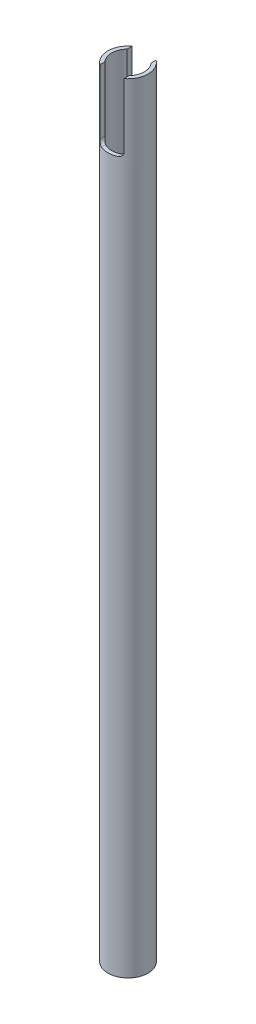
ISO-10303-21;
HEADER;
FILE_DESCRIPTION(('STEP AP214'),'2;1');
FILE_NAME('part.step','',(''),(''),'','','');
FILE_SCHEMA(('AUTOMOTIVE_DESIGN { 1 0 10303 214 1 1 1 1 }'));
ENDSEC;
DATA;
#1=APPLICATION_CONTEXT('core data for automotive mechanical design processes');
#2=APPLICATION_PROTOCOL_DEFINITION('international standard','automotive_design',2000,#1);
#3=PRODUCT_CONTEXT('',#1,'mechanical');
#4=PRODUCT('Part','Part','',(#3));
#5=PRODUCT_RELATED_PRODUCT_CATEGORY('part','',(#4));
#6=PRODUCT_DEFINITION_FORMATION('','',#4);
#7=PRODUCT_DEFINITION_CONTEXT('part definition',#1,'design');
#8=PRODUCT_DEFINITION('design','',#6,#7);
#9=PRODUCT_DEFINITION_SHAPE('','',#8);
#10=(LENGTH_UNIT() NAMED_UNIT(*) SI_UNIT(.MILLI.,.METRE.));
#11=(NAMED_UNIT(*) PLANE_ANGLE_UNIT() SI_UNIT($,.RADIAN.));
#12=(NAMED_UNIT(*) SI_UNIT($,.STERADIAN.) SOLID_ANGLE_UNIT());
#13=UNCERTAINTY_MEASURE_WITH_UNIT(LENGTH_MEASURE(1.E-05),#10,'distance_accuracy_value','');
#14=(GEOMETRIC_REPRESENTATION_CONTEXT(3) GLOBAL_UNCERTAINTY_ASSIGNED_CONTEXT((#13)) GLOBAL_UNIT_ASSIGNED_CONTEXT((#10,
#11,#12)) REPRESENTATION_CONTEXT('',''));
#15=CARTESIAN_POINT('',(0.,0.,0.));
#16=DIRECTION('',(0.,0.,1.));
#17=DIRECTION('',(1.,0.,0.));
#18=AXIS2_PLACEMENT_3D('',#15,#16,#17);
#19=CARTESIAN_POINT('',(4.76249999999999,159.829490670615,1.10722021828824E-13));
#20=DIRECTION('',(0.,1.,0.));
#21=DIRECTION('',(0.,0.,1.));
#22=AXIS2_PLACEMENT_3D('',#19,#20,#21);
#23=PLANE('',#22);
#24=DIRECTION('',(0.,0.,-1.));
#25=VECTOR('',#24,1.);
#26=CARTESIAN_POINT('',(4.76249999999999,159.829490670615,1.10722021828824E-13));
#27=LINE('',#26,#25);
#28=CARTESIAN_POINT('',(4.76249999999998,159.829490670615,6.35000000000001));
#29=VERTEX_POINT('',#28);
#30=CARTESIAN_POINT('',(4.76249999999998,159.829490670615,4.37101455499751));
#31=VERTEX_POINT('',#30);
#32=EDGE_CURVE('E246',#29,#31,#27,.T.);
#33=ORIENTED_EDGE('',*,*,#32,.F.);
#34=CARTESIAN_POINT('',(0.,159.829490670615,0.));
#35=DIRECTION('',(0.,1.,0.));
#36=DIRECTION('',(0.,0.,1.));
#37=AXIS2_PLACEMENT_3D('',#34,#35,#36);
#38=CIRCLE('',#37,7.9375);
#39=CARTESIAN_POINT('',(4.76249999999998,159.829490670615,-6.35000000000001));
#40=VERTEX_POINT('',#39);
#41=EDGE_CURVE('E247',#29,#40,#38,.T.);
#42=ORIENTED_EDGE('',*,*,#41,.T.);
#43=CARTESIAN_POINT('',(4.76249999999998,159.829490670615,-4.37101455499751));
#44=VERTEX_POINT('',#43);
#45=EDGE_CURVE('E243',#44,#40,#27,.T.);
#46=ORIENTED_EDGE('',*,*,#45,.F.);
#47=CARTESIAN_POINT('',(0.,159.829490670615,0.));
#48=DIRECTION('',(0.,1.,0.));
#49=DIRECTION('',(0.,0.,1.));
#50=AXIS2_PLACEMENT_3D('',#47,#48,#49);
#51=CIRCLE('',#50,6.4643);
#52=EDGE_CURVE('E249',#31,#44,#51,.T.);
#53=ORIENTED_EDGE('',*,*,#52,.F.);
#54=EDGE_LOOP('',(#33,#42,#46,#53));
#55=FACE_BOUND('',#54,.T.);
#56=ADVANCED_FACE('F37',(#55),#23,.T.);
#57=CARTESIAN_POINT('',(0.,207.680130973288,0.));
#58=DIRECTION('',(0.,-1.,0.));
#59=DIRECTION('',(0.,0.,-1.));
#60=AXIS2_PLACEMENT_3D('',#57,#58,#59);
#61=CYLINDRICAL_SURFACE('',#60,7.9375);
#62=CARTESIAN_POINT('',(0.,-148.161365670616,0.));
#63=DIRECTION('',(0.,1.,0.));
#64=DIRECTION('',(-1.,0.,0.));
#65=AXIS2_PLACEMENT_3D('',#62,#63,#64);
#66=CIRCLE('',#65,7.9375);
#67=CARTESIAN_POINT('',(-7.9375,-148.161365670616,0.));
#68=VERTEX_POINT('',#67);
#69=EDGE_CURVE('E253',#68,#68,#66,.T.);
#70=ORIENTED_EDGE('',*,*,#69,.T.);
#71=EDGE_LOOP('',(#70));
#72=FACE_BOUND('',#71,.T.);
#73=CARTESIAN_POINT('',(3.17499999999999,132.841990670615,-7.2748389157424));
#74=CARTESIAN_POINT('',(3.22487569453425,132.841993094484,-7.25307485540417));
#75=CARTESIAN_POINT('',(3.274492567832,132.844341606434,-7.23080554795687));
#76=CARTESIAN_POINT('',(3.37289033718754,132.85359743728,-7.18543271036869));
#77=CARTESIAN_POINT('',(3.42167156115909,132.860502923905,-7.16232951904412));
#78=CARTESIAN_POINT('',(3.56611570471118,132.887814579719,-7.09211764550769));
#79=CARTESIAN_POINT('',(3.66011856186092,132.914817262107,-7.0440018038699));
#80=CARTESIAN_POINT('',(3.84107078778217,132.985213580794,-6.94698755653216));
#81=CARTESIAN_POINT('',(3.92802904781838,133.028586151805,-6.8980902335829));
#82=CARTESIAN_POINT('',(4.09321317007074,133.130844403191,-6.80137319676495));
#83=CARTESIAN_POINT('',(4.17142721023876,133.18975073227,-6.75355500990623));
#84=CARTESIAN_POINT('',(4.31845673955017,133.323697238456,-6.66052338253226));
#85=CARTESIAN_POINT('',(4.38702844703401,133.399062960851,-6.6153900817169));
#86=CARTESIAN_POINT('',(4.50981135991026,133.564072335148,-6.53230425811804));
#87=CARTESIAN_POINT('',(4.56405473223481,133.653683269029,-6.49433570629763));
#88=CARTESIAN_POINT('',(4.64112527606564,133.81620518378,-6.43936275258805));
#89=CARTESIAN_POINT('',(4.66849379930055,133.886011522274,-6.4194887687527));
#90=CARTESIAN_POINT('',(4.71331012905918,134.030213179568,-6.3866574122785));
#91=CARTESIAN_POINT('',(4.73078142565714,134.104597164196,-6.37368366713093));
#92=CARTESIAN_POINT('',(4.74933481762469,134.221265273987,-6.35985758418539));
#93=CARTESIAN_POINT('',(4.75425832108804,134.262647772956,-6.35617506465633));
#94=CARTESIAN_POINT('',(4.76084494587786,134.345841424857,-6.35124146292008));
#95=CARTESIAN_POINT('',(4.76250593746032,134.387652839895,-6.3499919689789));
#96=CARTESIAN_POINT('',(4.7625,134.429490670615,-6.35));
#97=B_SPLINE_CURVE_WITH_KNOTS('',3,(#73,#74,#75,#76,#77,#78,#79,#80,#81,#82,#83,#84,#85,#86,#87,
#88,#89,#90,#91,#92,#93,#94,#95,#96),.UNSPECIFIED.,.F.,.F.,(4,2,2,2,2,2,2,2,2,2,2,4),(0.,
0.163134741826248,0.326203930291641,0.651568270919483,0.976515342176229,1.3018965555225,
1.63441480819453,1.96618009202411,2.19797287868909,2.42921319840965,2.5545436570532,
2.67995590335294),.UNSPECIFIED.);
#98=CARTESIAN_POINT('',(3.17499999999999,132.841990670615,-7.2748389157424));
#99=VERTEX_POINT('',#98);
#100=CARTESIAN_POINT('',(4.7625,134.429490670615,-6.35));
#101=VERTEX_POINT('',#100);
#102=EDGE_CURVE('E266',#99,#101,#97,.T.);
#103=ORIENTED_EDGE('',*,*,#102,.T.);
#104=DIRECTION('',(0.,-1.,0.));
#105=VECTOR('',#104,1.);
#106=CARTESIAN_POINT('',(4.76249999999998,207.680130973288,-6.35000000000002));
#107=LINE('',#106,#105);
#108=EDGE_CURVE('E165',#101,#40,#107,.F.);
#109=ORIENTED_EDGE('',*,*,#108,.T.);
#110=ORIENTED_EDGE('',*,*,#41,.F.);
#111=DIRECTION('',(0.,-1.,0.));
#112=VECTOR('',#111,1.);
#113=CARTESIAN_POINT('',(4.76249999999998,207.680130973288,6.35000000000002));
#114=LINE('',#113,#112);
#115=CARTESIAN_POINT('',(4.7625,134.429490670615,6.35));
#116=VERTEX_POINT('',#115);
#117=EDGE_CURVE('E143',#29,#116,#114,.T.);
#118=ORIENTED_EDGE('',*,*,#117,.T.);
#119=CARTESIAN_POINT('',(4.7625,134.429490670615,6.35));
#120=CARTESIAN_POINT('',(4.7625082448674,134.3904927793,6.34999071086022));
#121=CARTESIAN_POINT('',(4.7610632726301,134.351501396627,6.35107748079263));
#122=CARTESIAN_POINT('',(4.75533083326467,134.273870492987,6.35537238643741));
#123=CARTESIAN_POINT('',(4.75104522029691,134.235230759157,6.3585791383786));
#124=CARTESIAN_POINT('',(4.73973363079417,134.158849240364,6.36701482977134));
#125=CARTESIAN_POINT('',(4.73272636583943,134.121103152235,6.37222995942606));
#126=CARTESIAN_POINT('',(4.71608700933988,134.046516730503,6.38455454154737));
#127=CARTESIAN_POINT('',(4.70645461497861,134.009676501928,6.39166421255279));
#128=CARTESIAN_POINT('',(4.67386737688433,133.901054458319,6.4155746957905));
#129=CARTESIAN_POINT('',(4.64718423293437,133.830920861857,6.4349861317309));
#130=CARTESIAN_POINT('',(4.58509715733847,133.696490332029,6.47937042633874));
#131=CARTESIAN_POINT('',(4.54967880313767,133.632203294549,6.50435247594331));
#132=CARTESIAN_POINT('',(4.46778227168669,133.504767865878,6.56090826907613));
#133=CARTESIAN_POINT('',(4.42059170075591,133.442253367372,6.59287464735865));
#134=CARTESIAN_POINT('',(4.31865901887071,133.325769818628,6.66009188420645));
#135=CARTESIAN_POINT('',(4.26391390584545,133.271804183994,6.69534404668054));
#136=CARTESIAN_POINT('',(4.13710862775916,133.163515832686,6.77457072150754));
#137=CARTESIAN_POINT('',(4.06372658434957,133.111023769816,6.81894125525599));
#138=CARTESIAN_POINT('',(3.90956413216789,133.019303643997,6.90848604051013));
#139=CARTESIAN_POINT('',(3.82878148329405,132.980079614143,6.95366053201103));
#140=CARTESIAN_POINT('',(3.65528386374693,132.91333938494,7.04649776274162));
#141=CARTESIAN_POINT('',(3.56212854207915,132.88686954919,7.0941054567944));
#142=CARTESIAN_POINT('',(3.4190794913292,132.860113400901,7.16356321904351));
#143=CARTESIAN_POINT('',(3.37080082446716,132.853352558403,7.18640899036398));
#144=CARTESIAN_POINT('',(3.27343294928996,132.844291805327,7.23128092737776));
#145=CARTESIAN_POINT('',(3.2243434828451,132.841993344139,7.25330682449697));
#146=CARTESIAN_POINT('',(3.17499999999999,132.841990670615,7.2748389157424));
#147=B_SPLINE_CURVE_WITH_KNOTS('',3,(#119,#120,#121,#122,#123,#124,#125,#126,#127,#128,#129,
#130,#131,#132,#133,#134,#135,#136,#137,#138,#139,#140,#141,#142,#143,#144,#145,#146),
.UNSPECIFIED.,.F.,.F.,(4,2,2,2,2,2,2,2,2,2,2,2,2,4),(0.,0.116941137531796,0.233806019597313,
0.349881275925382,0.465969927549305,0.697392116346393,0.929198990779971,1.18206261379598,
1.43502701225736,1.73542703669411,2.0359182920662,2.3580459987034,2.519387738089,
2.68078187277973),.UNSPECIFIED.);
#148=CARTESIAN_POINT('',(3.17499999999999,132.841990670615,7.2748389157424));
#149=VERTEX_POINT('',#148);
#150=EDGE_CURVE('E259',#116,#149,#147,.T.);
#151=ORIENTED_EDGE('',*,*,#150,.T.);
#152=CARTESIAN_POINT('',(0.,132.841990670615,0.));
#153=DIRECTION('',(0.,-1.,0.));
#154=DIRECTION('',(0.,0.,-1.));
#155=AXIS2_PLACEMENT_3D('',#152,#153,#154);
#156=CIRCLE('',#155,7.9375);
#157=CARTESIAN_POINT('',(-3.17499999999997,132.841990670615,7.27483891574241));
#158=VERTEX_POINT('',#157);
#159=EDGE_CURVE('E326',#149,#158,#156,.T.);
#160=ORIENTED_EDGE('',*,*,#159,.T.);
#161=CARTESIAN_POINT('',(-3.17499999999997,132.841990670615,7.27483891574241));
#162=CARTESIAN_POINT('',(-3.22487569453424,132.841993094484,7.25307485540418));
#163=CARTESIAN_POINT('',(-3.27449256783198,132.844341606434,7.23080554795688));
#164=CARTESIAN_POINT('',(-3.37289033718753,132.85359743728,7.18543271036869));
#165=CARTESIAN_POINT('',(-3.42167156115908,132.860502923905,7.16232951904413));
#166=CARTESIAN_POINT('',(-3.56611570471117,132.887814579719,7.09211764550769));
#167=CARTESIAN_POINT('',(-3.66011856186091,132.914817262107,7.04400180386991));
#168=CARTESIAN_POINT('',(-3.84107078778216,132.985213580794,6.94698755653217));
#169=CARTESIAN_POINT('',(-3.92802904781836,133.028586151805,6.89809023358291));
#170=CARTESIAN_POINT('',(-4.09321317007072,133.130844403191,6.80137319676496));
#171=CARTESIAN_POINT('',(-4.17142721023875,133.18975073227,6.75355500990624));
#172=CARTESIAN_POINT('',(-4.31845673955015,133.323697238456,6.66052338253227));
#173=CARTESIAN_POINT('',(-4.38702844703399,133.399062960851,6.61539008171692));
#174=CARTESIAN_POINT('',(-4.50981135991024,133.564072335148,6.53230425811805));
#175=CARTESIAN_POINT('',(-4.56405473223479,133.653683269029,6.49433570629764));
#176=CARTESIAN_POINT('',(-4.64112527606562,133.81620518378,6.43936275258806));
#177=CARTESIAN_POINT('',(-4.66849379930054,133.886011522274,6.41948876875271));
#178=CARTESIAN_POINT('',(-4.71331012905917,134.030213179568,6.38665741227852));
#179=CARTESIAN_POINT('',(-4.73078142565713,134.104597164196,6.37368366713094));
#180=CARTESIAN_POINT('',(-4.74933481762467,134.221265273987,6.3598575841854));
#181=CARTESIAN_POINT('',(-4.75425832108802,134.262647772956,6.35617506465634));
#182=CARTESIAN_POINT('',(-4.76084494587785,134.345841424857,6.3512414629201));
#183=CARTESIAN_POINT('',(-4.7625059374603,134.387652839895,6.34999196897891));
#184=CARTESIAN_POINT('',(-4.76249999999998,134.429490670615,6.35000000000002));
#185=B_SPLINE_CURVE_WITH_KNOTS('',3,(#161,#162,#163,#164,#165,#166,#167,#168,#169,#170,#171,
#172,#173,#174,#175,#176,#177,#178,#179,#180,#181,#182,#183,#184),.UNSPECIFIED.,.F.,.F.,(4,2,2,
2,2,2,2,2,2,2,2,4),(0.,0.163134741826252,0.326203930291645,0.651568270919482,0.976515342176226,
1.30189655552249,1.63441480819449,1.9661800920241,2.19797287868909,2.42921319840964,
2.5545436570532,2.67995590335294),.UNSPECIFIED.);
#186=CARTESIAN_POINT('',(-4.76249999999997,134.429490670615,6.35));
#187=VERTEX_POINT('',#186);
#188=EDGE_CURVE('E142',#158,#187,#185,.T.);
#189=ORIENTED_EDGE('',*,*,#188,.T.);
#190=DIRECTION('',(0.,-1.,0.));
#191=VECTOR('',#190,1.);
#192=CARTESIAN_POINT('',(-4.76250000000001,207.680130973288,6.35));
#193=LINE('',#192,#191);
#194=CARTESIAN_POINT('',(-4.76249999999998,159.829490670615,6.35000000000001));
#195=VERTEX_POINT('',#194);
#196=EDGE_CURVE('E157',#187,#195,#193,.F.);
#197=ORIENTED_EDGE('',*,*,#196,.T.);
#198=CARTESIAN_POINT('',(-4.76249999999999,159.829490670615,-6.35000000000001));
#199=VERTEX_POINT('',#198);
#200=EDGE_CURVE('E155',#199,#195,#38,.T.);
#201=ORIENTED_EDGE('',*,*,#200,.F.);
#202=DIRECTION('',(0.,-1.,0.));
#203=VECTOR('',#202,1.);
#204=CARTESIAN_POINT('',(-4.76250000000001,207.680130973288,-6.35));
#205=LINE('',#204,#203);
#206=CARTESIAN_POINT('',(-4.76249999999997,134.429490670615,-6.35));
#207=VERTEX_POINT('',#206);
#208=EDGE_CURVE('E59',#199,#207,#205,.T.);
#209=ORIENTED_EDGE('',*,*,#208,.T.);
#210=CARTESIAN_POINT('',(-4.76249999999998,134.429490670615,-6.35000000000002));
#211=CARTESIAN_POINT('',(-4.76250824486738,134.3904927793,-6.34999071086023));
#212=CARTESIAN_POINT('',(-4.76106327263009,134.351501396627,-6.35107748079264));
#213=CARTESIAN_POINT('',(-4.75533083326465,134.273870492987,-6.35537238643743));
#214=CARTESIAN_POINT('',(-4.75104522029689,134.235230759157,-6.35857913837861));
#215=CARTESIAN_POINT('',(-4.73973363079415,134.158849240364,-6.36701482977135));
#216=CARTESIAN_POINT('',(-4.73272636583941,134.121103152235,-6.37222995942608));
#217=CARTESIAN_POINT('',(-4.71608700933986,134.046516730503,-6.38455454154738));
#218=CARTESIAN_POINT('',(-4.70645461497859,134.009676501928,-6.3916642125528));
#219=CARTESIAN_POINT('',(-4.67386737688432,133.901054458319,-6.41557469579051));
#220=CARTESIAN_POINT('',(-4.64718423293435,133.830920861857,-6.43498613173091));
#221=CARTESIAN_POINT('',(-4.58509715733845,133.696490332029,-6.47937042633875));
#222=CARTESIAN_POINT('',(-4.54967880313766,133.632203294549,-6.50435247594333));
#223=CARTESIAN_POINT('',(-4.46778227168667,133.504767865878,-6.56090826907614));
#224=CARTESIAN_POINT('',(-4.4205917007559,133.442253367372,-6.59287464735866));
#225=CARTESIAN_POINT('',(-4.3186590188707,133.325769818628,-6.66009188420646));
#226=CARTESIAN_POINT('',(-4.26391390584544,133.271804183994,-6.69534404668055));
#227=CARTESIAN_POINT('',(-4.13710862775914,133.163515832686,-6.77457072150755));
#228=CARTESIAN_POINT('',(-4.06372658434956,133.111023769816,-6.818941255256));
#229=CARTESIAN_POINT('',(-3.90956413216788,133.019303643997,-6.90848604051014));
#230=CARTESIAN_POINT('',(-3.82878148329403,132.980079614143,-6.95366053201104));
#231=CARTESIAN_POINT('',(-3.65528386374691,132.91333938494,-7.04649776274162));
#232=CARTESIAN_POINT('',(-3.56212854207914,132.88686954919,-7.0941054567944));
#233=CARTESIAN_POINT('',(-3.41907949132919,132.860113400901,-7.16356321904352));
#234=CARTESIAN_POINT('',(-3.37080082446715,132.853352558403,-7.18640899036399));
#235=CARTESIAN_POINT('',(-3.27343294928995,132.844291805327,-7.23128092737777));
#236=CARTESIAN_POINT('',(-3.22434348284509,132.841993344139,-7.25330682449697));
#237=CARTESIAN_POINT('',(-3.17499999999997,132.841990670615,-7.27483891574241));
#238=B_SPLINE_CURVE_WITH_KNOTS('',3,(#210,#211,#212,#213,#214,#215,#216,#217,#218,#219,#220,
#221,#222,#223,#224,#225,#226,#227,#228,#229,#230,#231,#232,#233,#234,#235,#236,#237),
.UNSPECIFIED.,.F.,.F.,(4,2,2,2,2,2,2,2,2,2,2,2,2,4),(0.,0.116941137531796,0.233806019597313,
0.34988127592541,0.465969927549306,0.697392116346393,0.929198990779971,1.18206261379597,
1.43502701225736,1.73542703669411,2.0359182920662,2.3580459987034,2.51938773808899,
2.68078187277972),.UNSPECIFIED.);
#239=CARTESIAN_POINT('',(-3.17499999999997,132.841990670615,-7.27483891574241));
#240=VERTEX_POINT('',#239);
#241=EDGE_CURVE('E135',#207,#240,#238,.T.);
#242=ORIENTED_EDGE('',*,*,#241,.T.);
#243=EDGE_CURVE('E327',#240,#99,#156,.T.);
#244=ORIENTED_EDGE('',*,*,#243,.T.);
#245=EDGE_LOOP('',(#103,#109,#110,#118,#151,#160,#189,#197,#201,#209,#242,#244));
#246=FACE_BOUND('',#245,.T.);
#247=ADVANCED_FACE('F39',(#72,#246),#61,.T.);
#248=CARTESIAN_POINT('',(0.,-148.161365670616,0.));
#249=DIRECTION('',(0.,1.,0.));
#250=DIRECTION('',(-1.,0.,0.));
#251=AXIS2_PLACEMENT_3D('',#248,#249,#250);
#252=PLANE('',#251);
#253=ORIENTED_EDGE('',*,*,#69,.F.);
#254=EDGE_LOOP('',(#253));
#255=FACE_BOUND('',#254,.T.);
#256=CARTESIAN_POINT('',(0.,-148.161365670616,0.));
#257=DIRECTION('',(0.,1.,0.));
#258=DIRECTION('',(-1.,0.,0.));
#259=AXIS2_PLACEMENT_3D('',#256,#257,#258);
#260=CIRCLE('',#259,6.4643);
#261=CARTESIAN_POINT('',(-6.4643,-148.161365670616,0.));
#262=VERTEX_POINT('',#261);
#263=EDGE_CURVE('E252',#262,#262,#260,.T.);
#264=ORIENTED_EDGE('',*,*,#263,.T.);
#265=EDGE_LOOP('',(#264));
#266=FACE_BOUND('',#265,.T.);
#267=ADVANCED_FACE('F216',(#255,#266),#252,.F.);
#268=CARTESIAN_POINT('',(0.,207.680130973288,0.));
#269=DIRECTION('',(0.,-1.,0.));
#270=DIRECTION('',(0.,0.,-1.));
#271=AXIS2_PLACEMENT_3D('',#268,#269,#270);
#272=CYLINDRICAL_SURFACE('',#271,6.4643);
#273=DIRECTION('',(0.,-1.,0.));
#274=VECTOR('',#273,1.);
#275=CARTESIAN_POINT('',(4.76249999999998,207.680130973288,-4.37101455499752));
#276=LINE('',#275,#274);
#277=CARTESIAN_POINT('',(4.7625,134.429490670615,-4.3710145549975));
#278=VERTEX_POINT('',#277);
#279=EDGE_CURVE('E156',#278,#44,#276,.F.);
#280=ORIENTED_EDGE('',*,*,#279,.F.);
#281=CARTESIAN_POINT('',(3.17499999999999,132.841990670615,-5.63085690548073));
#282=CARTESIAN_POINT('',(3.23415023287876,132.841993242892,-5.59751834130219));
#283=CARTESIAN_POINT('',(3.29273292435302,132.845295543379,-5.56324465228137));
#284=CARTESIAN_POINT('',(3.40825421739153,132.858145743846,-5.49322265658727));
#285=CARTESIAN_POINT('',(3.46519404697227,132.867688845625,-5.45747550254629));
#286=CARTESIAN_POINT('',(3.57693594096671,132.892650682742,-5.3848998448099));
#287=CARTESIAN_POINT('',(3.63174083949469,132.908061314075,-5.34807289694757));
#288=CARTESIAN_POINT('',(3.73893824785166,132.944453795517,-5.27368720920482));
#289=CARTESIAN_POINT('',(3.79133046682757,132.965436315275,-5.23612838186761));
#290=CARTESIAN_POINT('',(3.93363420616286,133.031366532149,-5.13093883799962));
#291=CARTESIAN_POINT('',(4.02061161466873,133.082176544961,-5.06291187000278));
#292=CARTESIAN_POINT('',(4.18430130662583,133.199999981053,-4.92848952887273));
#293=CARTESIAN_POINT('',(4.26101296502488,133.267014390275,-4.86209425528949));
#294=CARTESIAN_POINT('',(4.38700023528267,133.401019271964,-4.74836741397533));
#295=CARTESIAN_POINT('',(4.43862926676228,133.464920609766,-4.70000513167269));
#296=CARTESIAN_POINT('',(4.53284454882137,133.602832076129,-4.60920297656039));
#297=CARTESIAN_POINT('',(4.5754459787436,133.676824886511,-4.56675320410837));
#298=CARTESIAN_POINT('',(4.64001486155482,133.814584926065,-4.50100005808148));
#299=CARTESIAN_POINT('',(4.66447433775856,133.876161547885,-4.47557345186755));
#300=CARTESIAN_POINT('',(4.70591756599115,134.004117655018,-4.43197691392737));
#301=CARTESIAN_POINT('',(4.72292352576825,134.070482177049,-4.41378544032791));
#302=CARTESIAN_POINT('',(4.74441774926873,134.185788903133,-4.39065500102689));
#303=CARTESIAN_POINT('',(4.75114392555709,134.233849682147,-4.38336427769471));
#304=CARTESIAN_POINT('',(4.76021000647791,134.331079640239,-4.37350982478565));
#305=CARTESIAN_POINT('',(4.76252955685787,134.380252906242,-4.37096803145655));
#306=CARTESIAN_POINT('',(4.7625,134.429490670615,-4.3710145549975));
#307=B_SPLINE_CURVE_WITH_KNOTS('',3,(#281,#282,#283,#284,#285,#286,#287,#288,#289,#290,#291,
#292,#293,#294,#295,#296,#297,#298,#299,#300,#301,#302,#303,#304,#305,#306),.UNSPECIFIED.,.F.,
.F.,(4,2,2,2,2,2,2,2,2,2,2,2,4),(0.,0.203555382401363,0.406954446198594,0.610073596136075,
0.813217168711584,1.17628753330493,1.53937999416656,1.82445122140042,2.10903924773996,
2.32119459153727,2.53271344872142,2.67952079892846,2.82700462061787),.UNSPECIFIED.);
#308=CARTESIAN_POINT('',(3.17499999999999,132.841990670615,-5.63085690548073));
#309=VERTEX_POINT('',#308);
#310=EDGE_CURVE('E12',#309,#278,#307,.T.);
#311=ORIENTED_EDGE('',*,*,#310,.F.);
#312=CARTESIAN_POINT('',(0.,132.841990670615,0.));
#313=DIRECTION('',(0.,-1.,0.));
#314=DIRECTION('',(0.,0.,-1.));
#315=AXIS2_PLACEMENT_3D('',#312,#313,#314);
#316=CIRCLE('',#315,6.4643);
#317=CARTESIAN_POINT('',(-3.17499999999997,132.841990670615,-5.63085690548074));
#318=VERTEX_POINT('',#317);
#319=EDGE_CURVE('E52',#318,#309,#316,.T.);
#320=ORIENTED_EDGE('',*,*,#319,.F.);
#321=CARTESIAN_POINT('',(-4.76249999999998,134.429490670615,-4.37101455499752));
#322=CARTESIAN_POINT('',(-4.76251020174618,134.393672315443,-4.37099905147952));
#323=CARTESIAN_POINT('',(-4.76128817188465,134.357864840136,-4.37233485121594));
#324=CARTESIAN_POINT('',(-4.75645976794487,134.286645026579,-4.37758926988059));
#325=CARTESIAN_POINT('',(-4.75285635252568,134.251232253391,-4.38150468384977));
#326=CARTESIAN_POINT('',(-4.74339822878117,134.18147779473,-4.39174140667666));
#327=CARTESIAN_POINT('',(-4.73756920114439,134.147128553563,-4.39803526318287));
#328=CARTESIAN_POINT('',(-4.72379070929401,134.079346259199,-4.41283113071105));
#329=CARTESIAN_POINT('',(-4.71584070564425,134.045913441468,-4.42133370346999));
#330=CARTESIAN_POINT('',(-4.68911746592535,133.947629831307,-4.44972175085268));
#331=CARTESIAN_POINT('',(-4.66741404073483,133.884393285314,-4.47255067434324));
#332=CARTESIAN_POINT('',(-4.61736147665023,133.763094012489,-4.52420660634497));
#333=CARTESIAN_POINT('',(-4.58899007677425,133.705049535615,-4.55305366931484));
#334=CARTESIAN_POINT('',(-4.51076387619271,133.566315618749,-4.63082656289778));
#335=CARTESIAN_POINT('',(-4.45733143884927,133.489172147406,-4.6824900748663));
#336=CARTESIAN_POINT('',(-4.3402813635998,133.347479686238,-4.79119490203501));
#337=CARTESIAN_POINT('',(-4.27664732144448,133.28295135896,-4.84824481682388));
#338=CARTESIAN_POINT('',(-4.13894113294808,133.164811494633,-4.96636544142944));
#339=CARTESIAN_POINT('',(-4.06463278621144,133.111543319181,-5.02750322489827));
#340=CARTESIAN_POINT('',(-3.90833045293517,133.018589303285,-5.14995004801687));
#341=CARTESIAN_POINT('',(-3.82634732420193,132.978884633214,-5.21125873014659));
#342=CARTESIAN_POINT('',(-3.65273653347887,132.9126392665,-5.33445194521037));
#343=CARTESIAN_POINT('',(-3.56087230464129,132.886605658784,-5.39628206204178));
#344=CARTESIAN_POINT('',(-3.41898649394748,132.860110629206,-5.4864265731877));
#345=CARTESIAN_POINT('',(-3.37092622309587,132.8533708173,-5.51608849293094));
#346=CARTESIAN_POINT('',(-3.2737130686569,132.844311315251,-5.57433380074167));
#347=CARTESIAN_POINT('',(-3.22455958714401,132.841994107322,-5.60291657431557));
#348=CARTESIAN_POINT('',(-3.17499999999997,132.841990670615,-5.63085690548075));
#349=B_SPLINE_CURVE_WITH_KNOTS('',3,(#321,#322,#323,#324,#325,#326,#327,#328,#329,#330,#331,
#332,#333,#334,#335,#336,#337,#338,#339,#340,#341,#342,#343,#344,#345,#346,#347,#348),
.UNSPECIFIED.,.F.,.F.,(4,2,2,2,2,2,2,2,2,2,2,2,2,4),(0.,0.107391791317523,0.214650408121394,
0.320707075510847,0.426790742465267,0.637746158948288,0.849416111494264,1.16902344613827,
1.48914996371761,1.81795471556245,2.1463011291695,2.4860925223587,2.65655664709324,
2.82711641785387),.UNSPECIFIED.);
#350=CARTESIAN_POINT('',(-4.76249999999997,134.429490670615,-4.37101455499749));
#351=VERTEX_POINT('',#350);
#352=EDGE_CURVE('E200',#351,#318,#349,.T.);
#353=ORIENTED_EDGE('',*,*,#352,.F.);
#354=DIRECTION('',(0.,-1.,0.));
#355=VECTOR('',#354,1.);
#356=CARTESIAN_POINT('',(-4.76250000000001,207.680130973288,-4.37101455499749));
#357=LINE('',#356,#355);
#358=CARTESIAN_POINT('',(-4.76249999999998,159.829490670615,-4.37101455499752));
#359=VERTEX_POINT('',#358);
#360=EDGE_CURVE('E147',#359,#351,#357,.T.);
#361=ORIENTED_EDGE('',*,*,#360,.F.);
#362=CARTESIAN_POINT('',(-4.76249999999999,159.829490670615,4.37101455499752));
#363=VERTEX_POINT('',#362);
#364=EDGE_CURVE('E242',#359,#363,#51,.T.);
#365=ORIENTED_EDGE('',*,*,#364,.T.);
#366=DIRECTION('',(0.,-1.,0.));
#367=VECTOR('',#366,1.);
#368=CARTESIAN_POINT('',(-4.76250000000001,207.680130973288,4.37101455499749));
#369=LINE('',#368,#367);
#370=CARTESIAN_POINT('',(-4.76249999999997,134.429490670615,4.37101455499749));
#371=VERTEX_POINT('',#370);
#372=EDGE_CURVE('E67',#371,#363,#369,.F.);
#373=ORIENTED_EDGE('',*,*,#372,.F.);
#374=CARTESIAN_POINT('',(-3.17499999999997,132.841990670615,5.63085690548074));
#375=CARTESIAN_POINT('',(-3.23415023287874,132.841993242892,5.5975183413022));
#376=CARTESIAN_POINT('',(-3.292732924353,132.845295543379,5.56324465228138));
#377=CARTESIAN_POINT('',(-3.40825421739152,132.858145743846,5.49322265658728));
#378=CARTESIAN_POINT('',(-3.46519404697226,132.867688845625,5.45747550254629));
#379=CARTESIAN_POINT('',(-3.5769359409667,132.892650682742,5.38489984480991));
#380=CARTESIAN_POINT('',(-3.63174083949468,132.908061314075,5.34807289694758));
#381=CARTESIAN_POINT('',(-3.73893824785165,132.944453795517,5.27368720920483));
#382=CARTESIAN_POINT('',(-3.79133046682755,132.965436315275,5.23612838186762));
#383=CARTESIAN_POINT('',(-3.93363420616284,133.031366532149,5.13093883799963));
#384=CARTESIAN_POINT('',(-4.02061161466871,133.082176544961,5.06291187000279));
#385=CARTESIAN_POINT('',(-4.18430130662581,133.199999981053,4.92848952887274));
#386=CARTESIAN_POINT('',(-4.26101296502487,133.267014390275,4.8620942552895));
#387=CARTESIAN_POINT('',(-4.38700023528265,133.401019271964,4.74836741397535));
#388=CARTESIAN_POINT('',(-4.43862926676227,133.464920609766,4.70000513167271));
#389=CARTESIAN_POINT('',(-4.53284454882135,133.602832076129,4.60920297656041));
#390=CARTESIAN_POINT('',(-4.57544597874359,133.676824886511,4.56675320410839));
#391=CARTESIAN_POINT('',(-4.6400148615548,133.814584926065,4.50100005808149));
#392=CARTESIAN_POINT('',(-4.66447433775854,133.876161547885,4.47557345186757));
#393=CARTESIAN_POINT('',(-4.70591756599114,134.004117655018,4.43197691392738));
#394=CARTESIAN_POINT('',(-4.72292352576823,134.070482177049,4.41378544032793));
#395=CARTESIAN_POINT('',(-4.74441774926872,134.185788903133,4.3906550010269));
#396=CARTESIAN_POINT('',(-4.75114392555707,134.233849682147,4.38336427769472));
#397=CARTESIAN_POINT('',(-4.76021000647789,134.331079640239,4.37350982478567));
#398=CARTESIAN_POINT('',(-4.76252955685786,134.380252906242,4.37096803145657));
#399=CARTESIAN_POINT('',(-4.76249999999998,134.429490670615,4.37101455499752));
#400=B_SPLINE_CURVE_WITH_KNOTS('',3,(#374,#375,#376,#377,#378,#379,#380,#381,#382,#383,#384,
#385,#386,#387,#388,#389,#390,#391,#392,#393,#394,#395,#396,#397,#398,#399),.UNSPECIFIED.,.F.,
.F.,(4,2,2,2,2,2,2,2,2,2,2,2,4),(0.,0.203555382401362,0.406954446198594,0.610073596136075,
0.813217168711584,1.17628753330493,1.53937999416656,1.82445122140042,2.10903924773995,
2.32119459153727,2.53271344872142,2.67952079892846,2.82700462061786),.UNSPECIFIED.);
#401=CARTESIAN_POINT('',(-3.17499999999997,132.841990670615,5.63085690548074));
#402=VERTEX_POINT('',#401);
#403=EDGE_CURVE('E192',#402,#371,#400,.T.);
#404=ORIENTED_EDGE('',*,*,#403,.F.);
#405=CARTESIAN_POINT('',(3.17499999999999,132.841990670615,5.63085690548073));
#406=VERTEX_POINT('',#405);
#407=EDGE_CURVE('E303',#406,#402,#316,.T.);
#408=ORIENTED_EDGE('',*,*,#407,.F.);
#409=CARTESIAN_POINT('',(4.7625,134.429490670615,4.3710145549975));
#410=CARTESIAN_POINT('',(4.7625102017462,134.393672315443,4.37099905147951));
#411=CARTESIAN_POINT('',(4.76128817188466,134.357864840136,4.37233485121593));
#412=CARTESIAN_POINT('',(4.75645976794488,134.286645026579,4.37758926988057));
#413=CARTESIAN_POINT('',(4.7528563525257,134.251232253391,4.38150468384975));
#414=CARTESIAN_POINT('',(4.74339822878118,134.18147779473,4.39174140667664));
#415=CARTESIAN_POINT('',(4.73756920114441,134.147128553563,4.39803526318286));
#416=CARTESIAN_POINT('',(4.72379070929402,134.079346259199,4.41283113071104));
#417=CARTESIAN_POINT('',(4.71584070564427,134.045913441468,4.42133370346997));
#418=CARTESIAN_POINT('',(4.68911746592537,133.947629831307,4.44972175085266));
#419=CARTESIAN_POINT('',(4.66741404073485,133.884393285314,4.47255067434322));
#420=CARTESIAN_POINT('',(4.61736147665025,133.763094012489,4.52420660634496));
#421=CARTESIAN_POINT('',(4.58899007677427,133.705049535615,4.55305366931483));
#422=CARTESIAN_POINT('',(4.51076387619274,133.566315618749,4.63082656289776));
#423=CARTESIAN_POINT('',(4.4573314388493,133.489172147406,4.68249007486627));
#424=CARTESIAN_POINT('',(4.34028136359983,133.347479686238,4.79119490203499));
#425=CARTESIAN_POINT('',(4.2766473214445,133.28295135896,4.84824481682387));
#426=CARTESIAN_POINT('',(4.13894113294809,133.164811494633,4.96636544142943));
#427=CARTESIAN_POINT('',(4.06463278621145,133.111543319181,5.02750322489826));
#428=CARTESIAN_POINT('',(3.90833045293518,133.018589303285,5.14995004801686));
#429=CARTESIAN_POINT('',(3.82634732420194,132.978884633214,5.21125873014658));
#430=CARTESIAN_POINT('',(3.65273653347889,132.9126392665,5.33445194521036));
#431=CARTESIAN_POINT('',(3.5608723046413,132.886605658784,5.39628206204177));
#432=CARTESIAN_POINT('',(3.4189864939475,132.860110629206,5.48642657318769));
#433=CARTESIAN_POINT('',(3.37092622309588,132.8533708173,5.51608849293093));
#434=CARTESIAN_POINT('',(3.27371306865692,132.844311315251,5.57433380074166));
#435=CARTESIAN_POINT('',(3.22455958714402,132.841994107322,5.60291657431556));
#436=CARTESIAN_POINT('',(3.17499999999998,132.841990670615,5.63085690548074));
#437=B_SPLINE_CURVE_WITH_KNOTS('',3,(#409,#410,#411,#412,#413,#414,#415,#416,#417,#418,#419,
#420,#421,#422,#423,#424,#425,#426,#427,#428,#429,#430,#431,#432,#433,#434,#435,#436),
.UNSPECIFIED.,.F.,.F.,(4,2,2,2,2,2,2,2,2,2,2,2,2,4),(0.,0.107391791317523,0.214650408121394,
0.320707075510847,0.426790742465267,0.637746158948289,0.849416111494264,1.16902344613823,
1.4891499637176,1.81795471556246,2.1463011291695,2.4860925223587,2.65655664709324,
2.82711641785387),.UNSPECIFIED.);
#438=CARTESIAN_POINT('',(4.7625,134.429490670615,4.3710145549975));
#439=VERTEX_POINT('',#438);
#440=EDGE_CURVE('E206',#439,#406,#437,.T.);
#441=ORIENTED_EDGE('',*,*,#440,.F.);
#442=DIRECTION('',(0.,-1.,0.));
#443=VECTOR('',#442,1.);
#444=CARTESIAN_POINT('',(4.76249999999998,207.680130973288,4.37101455499752));
#445=LINE('',#444,#443);
#446=EDGE_CURVE('E159',#31,#439,#445,.T.);
#447=ORIENTED_EDGE('',*,*,#446,.F.);
#448=ORIENTED_EDGE('',*,*,#52,.T.);
#449=EDGE_LOOP('',(#280,#311,#320,#353,#361,#365,#373,#404,#408,#441,#447,#448));
#450=FACE_BOUND('',#449,.T.);
#451=ORIENTED_EDGE('',*,*,#263,.F.);
#452=EDGE_LOOP('',(#451));
#453=FACE_BOUND('',#452,.T.);
#454=ADVANCED_FACE('F211',(#450,#453),#272,.F.);
#455=DIRECTION('',(0.,0.,1.));
#456=VECTOR('',#455,1.);
#457=CARTESIAN_POINT('',(-4.76249999999998,159.829490670615,1.10722021828824E-13));
#458=LINE('',#457,#456);
#459=EDGE_CURVE('E240',#199,#359,#458,.T.);
#460=ORIENTED_EDGE('',*,*,#459,.F.);
#461=ORIENTED_EDGE('',*,*,#200,.T.);
#462=EDGE_CURVE('E244',#363,#195,#458,.T.);
#463=ORIENTED_EDGE('',*,*,#462,.F.);
#464=ORIENTED_EDGE('',*,*,#364,.F.);
#465=EDGE_LOOP('',(#460,#461,#463,#464));
#466=FACE_BOUND('',#465,.T.);
#467=ADVANCED_FACE('F215',(#466),#23,.T.);
#468=CARTESIAN_POINT('',(-4.76249999999998,159.829490670615,-7.9375));
#469=DIRECTION('',(-1.,0.,0.));
#470=DIRECTION('',(0.,-1.,0.));
#471=AXIS2_PLACEMENT_3D('',#468,#469,#470);
#472=PLANE('',#471);
#473=DIRECTION('',(0.,0.,1.));
#474=VECTOR('',#473,1.);
#475=CARTESIAN_POINT('',(-4.76249999999997,134.429490670615,-7.9375));
#476=LINE('',#475,#474);
#477=EDGE_CURVE('E149',#371,#187,#476,.T.);
#478=ORIENTED_EDGE('',*,*,#477,.F.);
#479=ORIENTED_EDGE('',*,*,#372,.T.);
#480=ORIENTED_EDGE('',*,*,#462,.T.);
#481=ORIENTED_EDGE('',*,*,#196,.F.);
#482=EDGE_LOOP('',(#478,#479,#480,#481));
#483=FACE_BOUND('',#482,.T.);
#484=ADVANCED_FACE('F186',(#483),#472,.F.);
#485=CARTESIAN_POINT('',(-3.17499999999997,134.429490670615,-7.9375));
#486=DIRECTION('',(0.,0.,1.));
#487=DIRECTION('',(1.,0.,0.));
#488=AXIS2_PLACEMENT_3D('',#485,#486,#487);
#489=CYLINDRICAL_SURFACE('',#488,1.58750000000001);
#490=DIRECTION('',(0.,0.,1.));
#491=VECTOR('',#490,1.);
#492=CARTESIAN_POINT('',(-3.17499999999997,132.841990670615,-7.9375));
#493=LINE('',#492,#491);
#494=EDGE_CURVE('E148',#402,#158,#493,.T.);
#495=ORIENTED_EDGE('',*,*,#494,.F.);
#496=ORIENTED_EDGE('',*,*,#403,.T.);
#497=ORIENTED_EDGE('',*,*,#477,.T.);
#498=ORIENTED_EDGE('',*,*,#188,.F.);
#499=EDGE_LOOP('',(#495,#496,#497,#498));
#500=FACE_BOUND('',#499,.T.);
#501=ADVANCED_FACE('F180',(#500),#489,.F.);
#502=CARTESIAN_POINT('',(3.17499999999999,132.841990670615,-7.9375));
#503=DIRECTION('',(0.,-1.,0.));
#504=DIRECTION('',(0.,0.,-1.));
#505=AXIS2_PLACEMENT_3D('',#502,#503,#504);
#506=PLANE('',#505);
#507=DIRECTION('',(0.,0.,1.));
#508=VECTOR('',#507,1.);
#509=CARTESIAN_POINT('',(3.17499999999999,132.841990670615,-7.9375));
#510=LINE('',#509,#508);
#511=EDGE_CURVE('E315',#406,#149,#510,.T.);
#512=ORIENTED_EDGE('',*,*,#511,.F.);
#513=ORIENTED_EDGE('',*,*,#407,.T.);
#514=ORIENTED_EDGE('',*,*,#494,.T.);
#515=ORIENTED_EDGE('',*,*,#159,.F.);
#516=EDGE_LOOP('',(#512,#513,#514,#515));
#517=FACE_BOUND('',#516,.T.);
#518=ADVANCED_FACE('F185',(#517),#506,.F.);
#519=CARTESIAN_POINT('',(4.76249999999998,159.829490670615,-7.9375));
#520=DIRECTION('',(1.,0.,0.));
#521=DIRECTION('',(0.,1.,0.));
#522=AXIS2_PLACEMENT_3D('',#519,#520,#521);
#523=PLANE('',#522);
#524=ORIENTED_EDGE('',*,*,#32,.T.);
#525=ORIENTED_EDGE('',*,*,#446,.T.);
#526=DIRECTION('',(0.,0.,1.));
#527=VECTOR('',#526,1.);
#528=CARTESIAN_POINT('',(4.7625,134.429490670615,-7.9375));
#529=LINE('',#528,#527);
#530=EDGE_CURVE('E290',#439,#116,#529,.T.);
#531=ORIENTED_EDGE('',*,*,#530,.T.);
#532=ORIENTED_EDGE('',*,*,#117,.F.);
#533=EDGE_LOOP('',(#524,#525,#531,#532));
#534=FACE_BOUND('',#533,.T.);
#535=ADVANCED_FACE('F275',(#534),#523,.F.);
#536=CARTESIAN_POINT('',(3.17499999999999,134.429490670615,-7.9375));
#537=DIRECTION('',(0.,0.,1.));
#538=DIRECTION('',(1.,0.,0.));
#539=AXIS2_PLACEMENT_3D('',#536,#537,#538);
#540=CYLINDRICAL_SURFACE('',#539,1.58750000000001);
#541=ORIENTED_EDGE('',*,*,#530,.F.);
#542=ORIENTED_EDGE('',*,*,#440,.T.);
#543=ORIENTED_EDGE('',*,*,#511,.T.);
#544=ORIENTED_EDGE('',*,*,#150,.F.);
#545=EDGE_LOOP('',(#541,#542,#543,#544));
#546=FACE_BOUND('',#545,.T.);
#547=ADVANCED_FACE('F271',(#546),#540,.F.);
#548=EDGE_CURVE('E295',#99,#309,#510,.T.);
#549=ORIENTED_EDGE('',*,*,#548,.T.);
#550=ORIENTED_EDGE('',*,*,#310,.T.);
#551=EDGE_CURVE('E294',#101,#278,#529,.T.);
#552=ORIENTED_EDGE('',*,*,#551,.F.);
#553=ORIENTED_EDGE('',*,*,#102,.F.);
#554=EDGE_LOOP('',(#549,#550,#552,#553));
#555=FACE_BOUND('',#554,.T.);
#556=ADVANCED_FACE('F274',(#555),#540,.F.);
#557=ORIENTED_EDGE('',*,*,#243,.F.);
#558=EDGE_CURVE('E140',#240,#318,#493,.T.);
#559=ORIENTED_EDGE('',*,*,#558,.T.);
#560=ORIENTED_EDGE('',*,*,#319,.T.);
#561=ORIENTED_EDGE('',*,*,#548,.F.);
#562=EDGE_LOOP('',(#557,#559,#560,#561));
#563=FACE_BOUND('',#562,.T.);
#564=ADVANCED_FACE('F284',(#563),#506,.F.);
#565=EDGE_CURVE('E137',#207,#351,#476,.T.);
#566=ORIENTED_EDGE('',*,*,#565,.T.);
#567=ORIENTED_EDGE('',*,*,#352,.T.);
#568=ORIENTED_EDGE('',*,*,#558,.F.);
#569=ORIENTED_EDGE('',*,*,#241,.F.);
#570=EDGE_LOOP('',(#566,#567,#568,#569));
#571=FACE_BOUND('',#570,.T.);
#572=ADVANCED_FACE('F136',(#571),#489,.F.);
#573=ORIENTED_EDGE('',*,*,#551,.T.);
#574=ORIENTED_EDGE('',*,*,#279,.T.);
#575=ORIENTED_EDGE('',*,*,#45,.T.);
#576=ORIENTED_EDGE('',*,*,#108,.F.);
#577=EDGE_LOOP('',(#573,#574,#575,#576));
#578=FACE_BOUND('',#577,.T.);
#579=ADVANCED_FACE('F287',(#578),#523,.F.);
#580=ORIENTED_EDGE('',*,*,#459,.T.);
#581=ORIENTED_EDGE('',*,*,#360,.T.);
#582=ORIENTED_EDGE('',*,*,#565,.F.);
#583=ORIENTED_EDGE('',*,*,#208,.F.);
#584=EDGE_LOOP('',(#580,#581,#582,#583));
#585=FACE_BOUND('',#584,.T.);
#586=ADVANCED_FACE('F145',(#585),#472,.F.);
#587=CLOSED_SHELL('',(#56,#247,#267,#454,#467,#484,#501,#518,#535,#547,#556,#564,#572,#579,#586));
#588=MANIFOLD_SOLID_BREP('B2',#587);
#589=ADVANCED_BREP_SHAPE_REPRESENTATION('',(#18,#588),#14);
#590=SHAPE_DEFINITION_REPRESENTATION(#9,#589);
ENDSEC;
END-ISO-10303-21;
